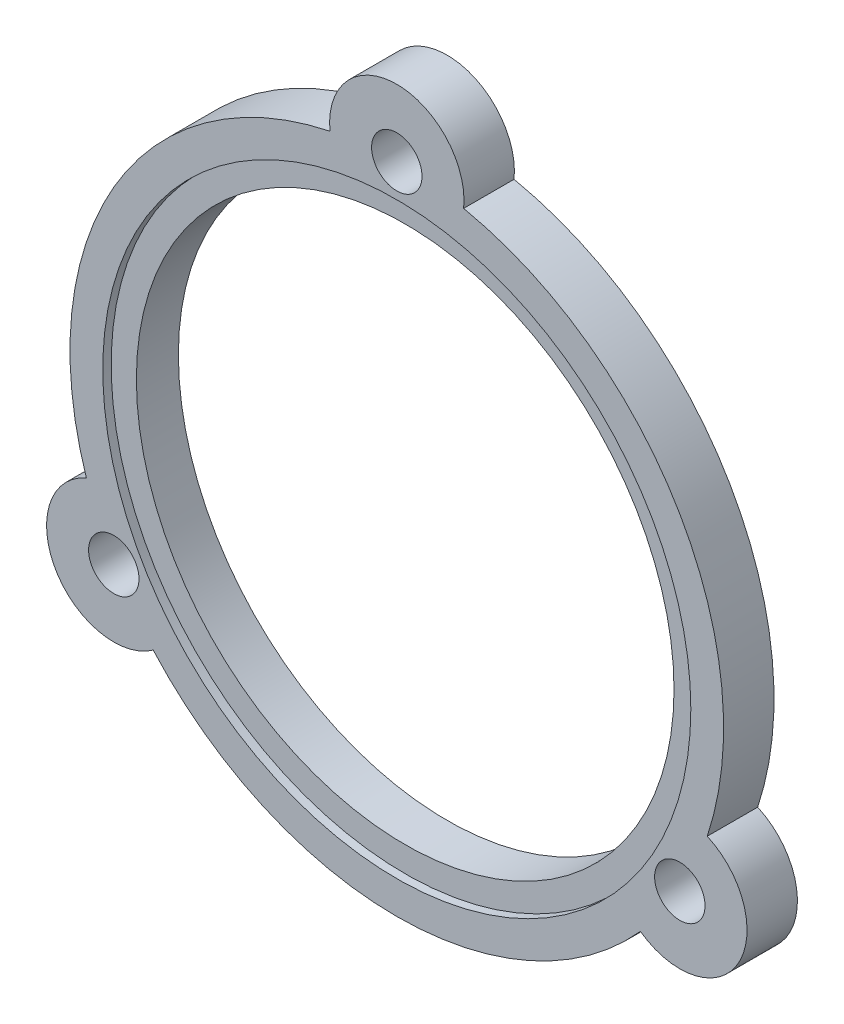
ISO-10303-21;
HEADER;
FILE_DESCRIPTION(('STEP AP214'),'2;1');
FILE_NAME('part.step','',(''),(''),'','','');
FILE_SCHEMA(('AUTOMOTIVE_DESIGN { 1 0 10303 214 1 1 1 1 }'));
ENDSEC;
DATA;
#1=APPLICATION_CONTEXT('core data for automotive mechanical design processes');
#2=APPLICATION_PROTOCOL_DEFINITION('international standard','automotive_design',2000,#1);
#3=PRODUCT_CONTEXT('',#1,'mechanical');
#4=PRODUCT('Part','Part','',(#3));
#5=PRODUCT_RELATED_PRODUCT_CATEGORY('part','',(#4));
#6=PRODUCT_DEFINITION_FORMATION('','',#4);
#7=PRODUCT_DEFINITION_CONTEXT('part definition',#1,'design');
#8=PRODUCT_DEFINITION('design','',#6,#7);
#9=PRODUCT_DEFINITION_SHAPE('','',#8);
#10=(LENGTH_UNIT() NAMED_UNIT(*) SI_UNIT(.MILLI.,.METRE.));
#11=(NAMED_UNIT(*) PLANE_ANGLE_UNIT() SI_UNIT($,.RADIAN.));
#12=(NAMED_UNIT(*) SI_UNIT($,.STERADIAN.) SOLID_ANGLE_UNIT());
#13=UNCERTAINTY_MEASURE_WITH_UNIT(LENGTH_MEASURE(1.E-05),#10,'distance_accuracy_value','');
#14=(GEOMETRIC_REPRESENTATION_CONTEXT(3) GLOBAL_UNCERTAINTY_ASSIGNED_CONTEXT((#13)) GLOBAL_UNIT_ASSIGNED_CONTEXT((#10,
#11,#12)) REPRESENTATION_CONTEXT('',''));
#15=CARTESIAN_POINT('',(0.,0.,0.));
#16=DIRECTION('',(0.,0.,1.));
#17=DIRECTION('',(1.,0.,0.));
#18=AXIS2_PLACEMENT_3D('',#15,#16,#17);
#19=CARTESIAN_POINT('',(0.,0.,3.));
#20=DIRECTION('',(0.,0.,-1.));
#21=DIRECTION('',(-1.,0.,0.));
#22=AXIS2_PLACEMENT_3D('',#19,#20,#21);
#23=CYLINDRICAL_SURFACE('',#22,16.);
#24=CARTESIAN_POINT('',(0.,0.,0.));
#25=DIRECTION('',(0.,0.,1.));
#26=DIRECTION('',(1.,0.,0.));
#27=AXIS2_PLACEMENT_3D('',#24,#25,#26);
#28=CIRCLE('',#27,16.);
#29=CARTESIAN_POINT('',(16.,0.,0.));
#30=VERTEX_POINT('',#29);
#31=EDGE_CURVE('E111',#30,#30,#28,.T.);
#32=ORIENTED_EDGE('',*,*,#31,.F.);
#33=EDGE_LOOP('',(#32));
#34=FACE_BOUND('',#33,.T.);
#35=CARTESIAN_POINT('',(0.,0.,2.5));
#36=DIRECTION('',(0.,0.,1.));
#37=DIRECTION('',(1.,0.,0.));
#38=AXIS2_PLACEMENT_3D('',#35,#36,#37);
#39=CIRCLE('',#38,16.);
#40=CARTESIAN_POINT('',(16.,0.,2.5));
#41=VERTEX_POINT('',#40);
#42=EDGE_CURVE('E39',#41,#41,#39,.T.);
#43=ORIENTED_EDGE('',*,*,#42,.T.);
#44=EDGE_LOOP('',(#43));
#45=FACE_BOUND('',#44,.T.);
#46=ADVANCED_FACE('F35',(#34,#45),#23,.F.);
#47=CARTESIAN_POINT('',(0.,0.,3.));
#48=DIRECTION('',(0.,0.,-1.));
#49=DIRECTION('',(-1.,0.,0.));
#50=AXIS2_PLACEMENT_3D('',#47,#48,#49);
#51=CYLINDRICAL_SURFACE('',#50,19.45);
#52=DIRECTION('',(0.,0.,-1.));
#53=VECTOR('',#52,1.);
#54=CARTESIAN_POINT('',(-14.4985899296783,-12.9650834957216,12.9403486300762));
#55=LINE('',#54,#53);
#56=CARTESIAN_POINT('',(-14.4985899296783,-12.9650834957216,3.));
#57=VERTEX_POINT('',#56);
#58=CARTESIAN_POINT('',(-14.4985899296783,-12.9650834957216,0.));
#59=VERTEX_POINT('',#58);
#60=EDGE_CURVE('E57',#57,#59,#55,.T.);
#61=ORIENTED_EDGE('',*,*,#60,.T.);
#62=CARTESIAN_POINT('',(0.,0.,0.));
#63=DIRECTION('',(0.,0.,1.));
#64=DIRECTION('',(1.,0.,0.));
#65=AXIS2_PLACEMENT_3D('',#62,#63,#64);
#66=CIRCLE('',#65,19.45);
#67=CARTESIAN_POINT('',(14.4985899296783,-12.9650834957216,0.));
#68=VERTEX_POINT('',#67);
#69=EDGE_CURVE('E105',#59,#68,#66,.T.);
#70=ORIENTED_EDGE('',*,*,#69,.T.);
#71=DIRECTION('',(0.,0.,-1.));
#72=VECTOR('',#71,1.);
#73=CARTESIAN_POINT('',(14.4985899296783,-12.9650834957216,12.9403486300762));
#74=LINE('',#73,#72);
#75=CARTESIAN_POINT('',(14.4985899296783,-12.9650834957216,3.));
#76=VERTEX_POINT('',#75);
#77=EDGE_CURVE('E151',#76,#68,#74,.T.);
#78=ORIENTED_EDGE('',*,*,#77,.F.);
#79=CARTESIAN_POINT('',(0.,0.,3.));
#80=DIRECTION('',(0.,0.,1.));
#81=DIRECTION('',(1.,0.,0.));
#82=AXIS2_PLACEMENT_3D('',#79,#80,#81);
#83=CIRCLE('',#82,19.45);
#84=EDGE_CURVE('E44',#57,#76,#83,.T.);
#85=ORIENTED_EDGE('',*,*,#84,.F.);
#86=EDGE_LOOP('',(#61,#70,#78,#85));
#87=FACE_BOUND('',#86,.T.);
#88=ADVANCED_FACE('F37',(#87),#51,.T.);
#89=DIRECTION('',(0.,0.,-1.));
#90=VECTOR('',#89,1.);
#91=CARTESIAN_POINT('',(-18.4773866343203,-6.07360545029401,12.9403486300762));
#92=LINE('',#91,#90);
#93=CARTESIAN_POINT('',(-18.4773866343203,-6.07360545029401,3.));
#94=VERTEX_POINT('',#93);
#95=CARTESIAN_POINT('',(-18.4773866343203,-6.07360545029401,0.));
#96=VERTEX_POINT('',#95);
#97=EDGE_CURVE('E89',#94,#96,#92,.T.);
#98=ORIENTED_EDGE('',*,*,#97,.F.);
#99=CARTESIAN_POINT('',(-3.97879670464202,19.0386889460154,3.));
#100=VERTEX_POINT('',#99);
#101=EDGE_CURVE('E11',#100,#94,#83,.T.);
#102=ORIENTED_EDGE('',*,*,#101,.F.);
#103=DIRECTION('',(0.,0.,-1.));
#104=VECTOR('',#103,1.);
#105=CARTESIAN_POINT('',(-3.97879670464201,19.0386889460154,12.1356261534175));
#106=LINE('',#105,#104);
#107=CARTESIAN_POINT('',(-3.97879670464202,19.0386889460154,0.));
#108=VERTEX_POINT('',#107);
#109=EDGE_CURVE('E110',#100,#108,#106,.T.);
#110=ORIENTED_EDGE('',*,*,#109,.T.);
#111=EDGE_CURVE('E102',#108,#96,#66,.T.);
#112=ORIENTED_EDGE('',*,*,#111,.T.);
#113=EDGE_LOOP('',(#98,#102,#110,#112));
#114=FACE_BOUND('',#113,.T.);
#115=ADVANCED_FACE('F108',(#114),#51,.T.);
#116=DIRECTION('',(0.,0.,-1.));
#117=VECTOR('',#116,1.);
#118=CARTESIAN_POINT('',(18.4773866343203,-6.07360545029401,12.9403486300762));
#119=LINE('',#118,#117);
#120=CARTESIAN_POINT('',(18.4773866343203,-6.073605450294,3.));
#121=VERTEX_POINT('',#120);
#122=CARTESIAN_POINT('',(18.4773866343203,-6.073605450294,0.));
#123=VERTEX_POINT('',#122);
#124=EDGE_CURVE('E149',#121,#123,#119,.T.);
#125=ORIENTED_EDGE('',*,*,#124,.T.);
#126=CARTESIAN_POINT('',(3.97879670464201,19.0386889460154,0.));
#127=VERTEX_POINT('',#126);
#128=EDGE_CURVE('E113',#123,#127,#66,.T.);
#129=ORIENTED_EDGE('',*,*,#128,.T.);
#130=DIRECTION('',(0.,0.,-1.));
#131=VECTOR('',#130,1.);
#132=CARTESIAN_POINT('',(3.97879670464201,19.0386889460154,12.1356261534175));
#133=LINE('',#132,#131);
#134=CARTESIAN_POINT('',(3.97879670464201,19.0386889460154,3.));
#135=VERTEX_POINT('',#134);
#136=EDGE_CURVE('E130',#135,#127,#133,.T.);
#137=ORIENTED_EDGE('',*,*,#136,.F.);
#138=EDGE_CURVE('E46',#121,#135,#83,.T.);
#139=ORIENTED_EDGE('',*,*,#138,.F.);
#140=EDGE_LOOP('',(#125,#129,#137,#139));
#141=FACE_BOUND('',#140,.T.);
#142=ADVANCED_FACE('F185',(#141),#51,.T.);
#143=CARTESIAN_POINT('',(0.,0.,3.));
#144=DIRECTION('',(0.,0.,1.));
#145=DIRECTION('',(1.,0.,0.));
#146=AXIS2_PLACEMENT_3D('',#143,#144,#145);
#147=PLANE('',#146);
#148=CARTESIAN_POINT('',(0.,0.,3.));
#149=DIRECTION('',(0.,0.,1.));
#150=DIRECTION('',(1.,0.,0.));
#151=AXIS2_PLACEMENT_3D('',#148,#149,#150);
#152=CIRCLE('',#151,17.5);
#153=CARTESIAN_POINT('',(17.5,0.,3.));
#154=VERTEX_POINT('',#153);
#155=EDGE_CURVE('E160',#154,#154,#152,.T.);
#156=ORIENTED_EDGE('',*,*,#155,.F.);
#157=EDGE_LOOP('',(#156));
#158=FACE_BOUND('',#157,.T.);
#159=CARTESIAN_POINT('',(-16.8441941036073,-9.72500000000008,3.));
#160=DIRECTION('',(0.,0.,1.));
#161=DIRECTION('',(1.,0.,0.));
#162=AXIS2_PLACEMENT_3D('',#159,#160,#161);
#163=CIRCLE('',#162,4.);
#164=EDGE_CURVE('E93',#94,#57,#163,.T.);
#165=ORIENTED_EDGE('',*,*,#164,.T.);
#166=ORIENTED_EDGE('',*,*,#84,.T.);
#167=CARTESIAN_POINT('',(16.8441941036073,-9.72500000000008,3.));
#168=DIRECTION('',(0.,0.,1.));
#169=DIRECTION('',(1.,0.,0.));
#170=AXIS2_PLACEMENT_3D('',#167,#168,#169);
#171=CIRCLE('',#170,4.);
#172=EDGE_CURVE('E106',#76,#121,#171,.T.);
#173=ORIENTED_EDGE('',*,*,#172,.T.);
#174=ORIENTED_EDGE('',*,*,#138,.T.);
#175=CARTESIAN_POINT('',(0.,19.45,3.));
#176=DIRECTION('',(0.,0.,1.));
#177=DIRECTION('',(1.,0.,0.));
#178=AXIS2_PLACEMENT_3D('',#175,#176,#177);
#179=CIRCLE('',#178,4.);
#180=EDGE_CURVE('E131',#135,#100,#179,.T.);
#181=ORIENTED_EDGE('',*,*,#180,.T.);
#182=ORIENTED_EDGE('',*,*,#101,.T.);
#183=EDGE_LOOP('',(#165,#166,#173,#174,#181,#182));
#184=FACE_BOUND('',#183,.T.);
#185=CARTESIAN_POINT('',(-16.8441941036073,-9.72500000000008,3.));
#186=DIRECTION('',(0.,0.,1.));
#187=DIRECTION('',(1.,0.,0.));
#188=AXIS2_PLACEMENT_3D('',#185,#186,#187);
#189=CIRCLE('',#188,1.5);
#190=CARTESIAN_POINT('',(-15.3441941036073,-9.72500000000008,3.));
#191=VERTEX_POINT('',#190);
#192=EDGE_CURVE('E137',#191,#191,#189,.T.);
#193=ORIENTED_EDGE('',*,*,#192,.F.);
#194=EDGE_LOOP('',(#193));
#195=FACE_BOUND('',#194,.T.);
#196=CARTESIAN_POINT('',(16.8441941036073,-9.72500000000008,3.));
#197=DIRECTION('',(0.,0.,1.));
#198=DIRECTION('',(1.,0.,0.));
#199=AXIS2_PLACEMENT_3D('',#196,#197,#198);
#200=CIRCLE('',#199,1.5);
#201=CARTESIAN_POINT('',(18.3441941036073,-9.72500000000008,3.));
#202=VERTEX_POINT('',#201);
#203=EDGE_CURVE('E135',#202,#202,#200,.T.);
#204=ORIENTED_EDGE('',*,*,#203,.F.);
#205=EDGE_LOOP('',(#204));
#206=FACE_BOUND('',#205,.T.);
#207=CARTESIAN_POINT('',(0.,19.45,3.));
#208=DIRECTION('',(0.,0.,1.));
#209=DIRECTION('',(1.,0.,0.));
#210=AXIS2_PLACEMENT_3D('',#207,#208,#209);
#211=CIRCLE('',#210,1.5);
#212=CARTESIAN_POINT('',(-1.5,19.45,3.));
#213=VERTEX_POINT('',#212);
#214=EDGE_CURVE('E115',#213,#213,#211,.T.);
#215=ORIENTED_EDGE('',*,*,#214,.F.);
#216=EDGE_LOOP('',(#215));
#217=FACE_BOUND('',#216,.T.);
#218=ADVANCED_FACE('F191',(#158,#184,#195,#206,#217),#147,.T.);
#219=CARTESIAN_POINT('',(0.,0.,0.));
#220=DIRECTION('',(0.,0.,1.));
#221=DIRECTION('',(1.,0.,0.));
#222=AXIS2_PLACEMENT_3D('',#219,#220,#221);
#223=PLANE('',#222);
#224=ORIENTED_EDGE('',*,*,#69,.F.);
#225=CARTESIAN_POINT('',(-16.8441941036073,-9.72500000000008,0.));
#226=DIRECTION('',(0.,0.,1.));
#227=DIRECTION('',(-0.500000000000004,0.866025403784436,0.));
#228=AXIS2_PLACEMENT_3D('',#225,#226,#227);
#229=CIRCLE('',#228,4.);
#230=EDGE_CURVE('E92',#96,#59,#229,.T.);
#231=ORIENTED_EDGE('',*,*,#230,.F.);
#232=ORIENTED_EDGE('',*,*,#111,.F.);
#233=CARTESIAN_POINT('',(0.,19.45,0.));
#234=DIRECTION('',(0.,0.,1.));
#235=DIRECTION('',(1.,0.,0.));
#236=AXIS2_PLACEMENT_3D('',#233,#234,#235);
#237=CIRCLE('',#236,4.);
#238=EDGE_CURVE('E126',#127,#108,#237,.T.);
#239=ORIENTED_EDGE('',*,*,#238,.F.);
#240=ORIENTED_EDGE('',*,*,#128,.F.);
#241=CARTESIAN_POINT('',(16.8441941036073,-9.72500000000008,0.));
#242=DIRECTION('',(0.,0.,1.));
#243=DIRECTION('',(-0.500000000000004,-0.866025403784436,0.));
#244=AXIS2_PLACEMENT_3D('',#241,#242,#243);
#245=CIRCLE('',#244,4.);
#246=EDGE_CURVE('E144',#68,#123,#245,.T.);
#247=ORIENTED_EDGE('',*,*,#246,.F.);
#248=EDGE_LOOP('',(#224,#231,#232,#239,#240,#247));
#249=FACE_BOUND('',#248,.T.);
#250=CARTESIAN_POINT('',(-16.8441941036073,-9.72500000000008,0.));
#251=DIRECTION('',(0.,0.,1.));
#252=DIRECTION('',(-0.500000000000004,0.866025403784436,0.));
#253=AXIS2_PLACEMENT_3D('',#250,#251,#252);
#254=CIRCLE('',#253,1.5);
#255=CARTESIAN_POINT('',(-17.5941941036073,-8.42596189432342,0.));
#256=VERTEX_POINT('',#255);
#257=EDGE_CURVE('E141',#256,#256,#254,.T.);
#258=ORIENTED_EDGE('',*,*,#257,.T.);
#259=EDGE_LOOP('',(#258));
#260=FACE_BOUND('',#259,.T.);
#261=CARTESIAN_POINT('',(16.8441941036073,-9.72500000000008,0.));
#262=DIRECTION('',(0.,0.,1.));
#263=DIRECTION('',(-0.500000000000004,-0.866025403784436,0.));
#264=AXIS2_PLACEMENT_3D('',#261,#262,#263);
#265=CIRCLE('',#264,1.5);
#266=CARTESIAN_POINT('',(16.0941941036073,-11.0240381056767,0.));
#267=VERTEX_POINT('',#266);
#268=EDGE_CURVE('E140',#267,#267,#265,.T.);
#269=ORIENTED_EDGE('',*,*,#268,.T.);
#270=EDGE_LOOP('',(#269));
#271=FACE_BOUND('',#270,.T.);
#272=CARTESIAN_POINT('',(0.,19.45,0.));
#273=DIRECTION('',(0.,0.,1.));
#274=DIRECTION('',(1.,0.,0.));
#275=AXIS2_PLACEMENT_3D('',#272,#273,#274);
#276=CIRCLE('',#275,1.5);
#277=CARTESIAN_POINT('',(-1.5,19.45,0.));
#278=VERTEX_POINT('',#277);
#279=EDGE_CURVE('E121',#278,#278,#276,.T.);
#280=ORIENTED_EDGE('',*,*,#279,.T.);
#281=EDGE_LOOP('',(#280));
#282=FACE_BOUND('',#281,.T.);
#283=ORIENTED_EDGE('',*,*,#31,.T.);
#284=EDGE_LOOP('',(#283));
#285=FACE_BOUND('',#284,.T.);
#286=ADVANCED_FACE('F99',(#249,#260,#271,#282,#285),#223,.F.);
#287=CARTESIAN_POINT('',(0.,19.45,6.35210647982962));
#288=DIRECTION('',(0.,0.,-1.));
#289=DIRECTION('',(-1.,0.,0.));
#290=AXIS2_PLACEMENT_3D('',#287,#288,#289);
#291=CYLINDRICAL_SURFACE('',#290,1.5);
#292=CARTESIAN_POINT('',(-1.5,19.45,0.));
#293=CARTESIAN_POINT('',(-1.5,19.45,0.03125));
#294=CARTESIAN_POINT('',(-1.5,19.45,0.0625000000000001));
#295=CARTESIAN_POINT('',(-1.5,19.45,0.125));
#296=CARTESIAN_POINT('',(-1.5,19.45,0.15625));
#297=CARTESIAN_POINT('',(-1.5,19.45,0.21875));
#298=CARTESIAN_POINT('',(-1.5,19.45,0.25));
#299=CARTESIAN_POINT('',(-1.5,19.45,0.3125));
#300=CARTESIAN_POINT('',(-1.5,19.45,0.34375));
#301=CARTESIAN_POINT('',(-1.5,19.45,0.40625));
#302=CARTESIAN_POINT('',(-1.5,19.45,0.4375));
#303=CARTESIAN_POINT('',(-1.5,19.45,0.5));
#304=CARTESIAN_POINT('',(-1.5,19.45,0.53125));
#305=CARTESIAN_POINT('',(-1.5,19.45,0.59375));
#306=CARTESIAN_POINT('',(-1.5,19.45,0.625));
#307=CARTESIAN_POINT('',(-1.5,19.45,0.6875));
#308=CARTESIAN_POINT('',(-1.5,19.45,0.71875));
#309=CARTESIAN_POINT('',(-1.5,19.45,0.78125));
#310=CARTESIAN_POINT('',(-1.5,19.45,0.8125));
#311=CARTESIAN_POINT('',(-1.5,19.45,0.875));
#312=CARTESIAN_POINT('',(-1.5,19.45,0.90625));
#313=CARTESIAN_POINT('',(-1.5,19.45,0.96875));
#314=CARTESIAN_POINT('',(-1.5,19.45,1.));
#315=CARTESIAN_POINT('',(-1.5,19.45,1.0625));
#316=CARTESIAN_POINT('',(-1.5,19.45,1.09375));
#317=CARTESIAN_POINT('',(-1.5,19.45,1.15625));
#318=CARTESIAN_POINT('',(-1.5,19.45,1.1875));
#319=CARTESIAN_POINT('',(-1.5,19.45,1.25));
#320=CARTESIAN_POINT('',(-1.5,19.45,1.28125));
#321=CARTESIAN_POINT('',(-1.5,19.45,1.34375));
#322=CARTESIAN_POINT('',(-1.5,19.45,1.375));
#323=CARTESIAN_POINT('',(-1.5,19.45,1.4375));
#324=CARTESIAN_POINT('',(-1.5,19.45,1.46875));
#325=CARTESIAN_POINT('',(-1.5,19.45,1.53125));
#326=CARTESIAN_POINT('',(-1.5,19.45,1.5625));
#327=CARTESIAN_POINT('',(-1.5,19.45,1.625));
#328=CARTESIAN_POINT('',(-1.5,19.45,1.65625));
#329=CARTESIAN_POINT('',(-1.5,19.45,1.71875));
#330=CARTESIAN_POINT('',(-1.5,19.45,1.75));
#331=CARTESIAN_POINT('',(-1.5,19.45,1.8125));
#332=CARTESIAN_POINT('',(-1.5,19.45,1.84375));
#333=CARTESIAN_POINT('',(-1.5,19.45,1.90625));
#334=CARTESIAN_POINT('',(-1.5,19.45,1.9375));
#335=CARTESIAN_POINT('',(-1.5,19.45,2.));
#336=CARTESIAN_POINT('',(-1.5,19.45,2.03125));
#337=CARTESIAN_POINT('',(-1.5,19.45,2.09375));
#338=CARTESIAN_POINT('',(-1.5,19.45,2.125));
#339=CARTESIAN_POINT('',(-1.5,19.45,2.1875));
#340=CARTESIAN_POINT('',(-1.5,19.45,2.21875));
#341=CARTESIAN_POINT('',(-1.5,19.45,2.28125));
#342=CARTESIAN_POINT('',(-1.5,19.45,2.3125));
#343=CARTESIAN_POINT('',(-1.5,19.45,2.375));
#344=CARTESIAN_POINT('',(-1.5,19.45,2.40625));
#345=CARTESIAN_POINT('',(-1.5,19.45,2.46875));
#346=CARTESIAN_POINT('',(-1.5,19.45,2.5));
#347=CARTESIAN_POINT('',(-1.5,19.45,2.5625));
#348=CARTESIAN_POINT('',(-1.5,19.45,2.59375));
#349=CARTESIAN_POINT('',(-1.5,19.45,2.65625));
#350=CARTESIAN_POINT('',(-1.5,19.45,2.6875));
#351=CARTESIAN_POINT('',(-1.5,19.45,2.75));
#352=CARTESIAN_POINT('',(-1.5,19.45,2.78125));
#353=CARTESIAN_POINT('',(-1.5,19.45,2.84375));
#354=CARTESIAN_POINT('',(-1.5,19.45,2.875));
#355=CARTESIAN_POINT('',(-1.5,19.45,2.9375));
#356=CARTESIAN_POINT('',(-1.5,19.45,2.96875));
#357=CARTESIAN_POINT('',(-1.5,19.45,3.));
#358=B_SPLINE_CURVE_WITH_KNOTS('',3,(#292,#293,#294,#295,#296,#297,#298,#299,#300,#301,#302,
#303,#304,#305,#306,#307,#308,#309,#310,#311,#312,#313,#314,#315,#316,#317,#318,#319,#320,#321,
#322,#323,#324,#325,#326,#327,#328,#329,#330,#331,#332,#333,#334,#335,#336,#337,#338,#339,#340,
#341,#342,#343,#344,#345,#346,#347,#348,#349,#350,#351,#352,#353,#354,#355,#356,#357),
.UNSPECIFIED.,.F.,.F.,(4,2,2,2,2,2,2,2,2,2,2,2,2,2,2,2,2,2,2,2,2,2,2,2,2,2,2,2,2,2,2,2,4),(0.,
0.0937500000000001,0.1875,0.28125,0.375,0.46875,0.5625,0.65625,0.75,0.84375,0.9375,1.03125,
1.125,1.21875,1.3125,1.40625,1.5,1.59375,1.6875,1.78125,1.875,1.96875,2.0625,2.15625,2.25,
2.34375,2.4375,2.53125,2.625,2.71875,2.8125,2.90625,3.),.UNSPECIFIED.);
#359=EDGE_CURVE('BSEAM190',#278,#213,#358,.T.);
#360=ORIENTED_EDGE('',*,*,#279,.F.);
#361=ORIENTED_EDGE('',*,*,#214,.T.);
#362=ORIENTED_EDGE('',*,*,#359,.T.);
#363=ORIENTED_EDGE('',*,*,#359,.F.);
#364=EDGE_LOOP('',(#360,#362,#361,#363));
#365=FACE_BOUND('',#364,.T.);
#366=ADVANCED_FACE('F190',(#365),#291,.F.);
#367=CARTESIAN_POINT('',(0.,19.45,12.1356261534175));
#368=DIRECTION('',(0.,0.,-1.));
#369=DIRECTION('',(-1.,0.,0.));
#370=AXIS2_PLACEMENT_3D('',#367,#368,#369);
#371=CYLINDRICAL_SURFACE('',#370,4.);
#372=ORIENTED_EDGE('',*,*,#180,.F.);
#373=ORIENTED_EDGE('',*,*,#136,.T.);
#374=ORIENTED_EDGE('',*,*,#238,.T.);
#375=ORIENTED_EDGE('',*,*,#109,.F.);
#376=EDGE_LOOP('',(#372,#373,#374,#375));
#377=FACE_BOUND('',#376,.T.);
#378=ADVANCED_FACE('F197',(#377),#371,.T.);
#379=CARTESIAN_POINT('',(-16.8441941036073,-9.72500000000008,6.53628968050303));
#380=DIRECTION('',(0.,0.,-1.));
#381=DIRECTION('',(-1.,0.,0.));
#382=AXIS2_PLACEMENT_3D('',#379,#380,#381);
#383=CYLINDRICAL_SURFACE('',#382,1.5);
#384=ORIENTED_EDGE('',*,*,#257,.F.);
#385=EDGE_LOOP('',(#384));
#386=FACE_BOUND('',#385,.T.);
#387=ORIENTED_EDGE('',*,*,#192,.T.);
#388=EDGE_LOOP('',(#387));
#389=FACE_BOUND('',#388,.T.);
#390=ADVANCED_FACE('F201',(#386,#389),#383,.F.);
#391=CARTESIAN_POINT('',(16.8441941036073,-9.72500000000008,6.53628968050303));
#392=DIRECTION('',(0.,0.,-1.));
#393=DIRECTION('',(-1.,0.,0.));
#394=AXIS2_PLACEMENT_3D('',#391,#392,#393);
#395=CYLINDRICAL_SURFACE('',#394,1.5);
#396=ORIENTED_EDGE('',*,*,#268,.F.);
#397=EDGE_LOOP('',(#396));
#398=FACE_BOUND('',#397,.T.);
#399=ORIENTED_EDGE('',*,*,#203,.T.);
#400=EDGE_LOOP('',(#399));
#401=FACE_BOUND('',#400,.T.);
#402=ADVANCED_FACE('F205',(#398,#401),#395,.F.);
#403=CARTESIAN_POINT('',(16.8441941036073,-9.72500000000008,12.9403486300762));
#404=DIRECTION('',(0.,0.,-1.));
#405=DIRECTION('',(-1.,0.,0.));
#406=AXIS2_PLACEMENT_3D('',#403,#404,#405);
#407=CYLINDRICAL_SURFACE('',#406,4.);
#408=ORIENTED_EDGE('',*,*,#172,.F.);
#409=ORIENTED_EDGE('',*,*,#77,.T.);
#410=ORIENTED_EDGE('',*,*,#246,.T.);
#411=ORIENTED_EDGE('',*,*,#124,.F.);
#412=EDGE_LOOP('',(#408,#409,#410,#411));
#413=FACE_BOUND('',#412,.T.);
#414=ADVANCED_FACE('F209',(#413),#407,.T.);
#415=CARTESIAN_POINT('',(-16.8441941036073,-9.72500000000008,12.9403486300762));
#416=DIRECTION('',(0.,0.,-1.));
#417=DIRECTION('',(-1.,0.,0.));
#418=AXIS2_PLACEMENT_3D('',#415,#416,#417);
#419=CYLINDRICAL_SURFACE('',#418,4.);
#420=ORIENTED_EDGE('',*,*,#164,.F.);
#421=ORIENTED_EDGE('',*,*,#97,.T.);
#422=ORIENTED_EDGE('',*,*,#230,.T.);
#423=ORIENTED_EDGE('',*,*,#60,.F.);
#424=EDGE_LOOP('',(#420,#421,#422,#423));
#425=FACE_BOUND('',#424,.T.);
#426=ADVANCED_FACE('F91',(#425),#419,.T.);
#427=CARTESIAN_POINT('',(0.,0.,2.5));
#428=DIRECTION('',(0.,0.,1.));
#429=DIRECTION('',(1.,0.,0.));
#430=AXIS2_PLACEMENT_3D('',#427,#428,#429);
#431=CYLINDRICAL_SURFACE('',#430,17.5);
#432=CARTESIAN_POINT('',(0.,0.,2.5));
#433=DIRECTION('',(0.,0.,1.));
#434=DIRECTION('',(1.,0.,0.));
#435=AXIS2_PLACEMENT_3D('',#432,#433,#434);
#436=CIRCLE('',#435,17.5);
#437=CARTESIAN_POINT('',(17.5,0.,2.5));
#438=VERTEX_POINT('',#437);
#439=EDGE_CURVE('E163',#438,#438,#436,.T.);
#440=ORIENTED_EDGE('',*,*,#439,.F.);
#441=EDGE_LOOP('',(#440));
#442=FACE_BOUND('',#441,.T.);
#443=ORIENTED_EDGE('',*,*,#155,.T.);
#444=EDGE_LOOP('',(#443));
#445=FACE_BOUND('',#444,.T.);
#446=ADVANCED_FACE('F173',(#442,#445),#431,.F.);
#447=CARTESIAN_POINT('',(0.,0.,2.5));
#448=DIRECTION('',(0.,0.,1.));
#449=DIRECTION('',(1.,0.,0.));
#450=AXIS2_PLACEMENT_3D('',#447,#448,#449);
#451=PLANE('',#450);
#452=ORIENTED_EDGE('',*,*,#42,.F.);
#453=EDGE_LOOP('',(#452));
#454=FACE_BOUND('',#453,.T.);
#455=ORIENTED_EDGE('',*,*,#439,.T.);
#456=EDGE_LOOP('',(#455));
#457=FACE_BOUND('',#456,.T.);
#458=ADVANCED_FACE('F171',(#454,#457),#451,.T.);
#459=CLOSED_SHELL('',(#46,#88,#115,#142,#218,#286,#366,#378,#390,#402,#414,#426,#446,#458));
#460=MANIFOLD_SOLID_BREP('B2',#459);
#461=ADVANCED_BREP_SHAPE_REPRESENTATION('',(#18,#460),#14);
#462=SHAPE_DEFINITION_REPRESENTATION(#9,#461);
ENDSEC;
END-ISO-10303-21;
